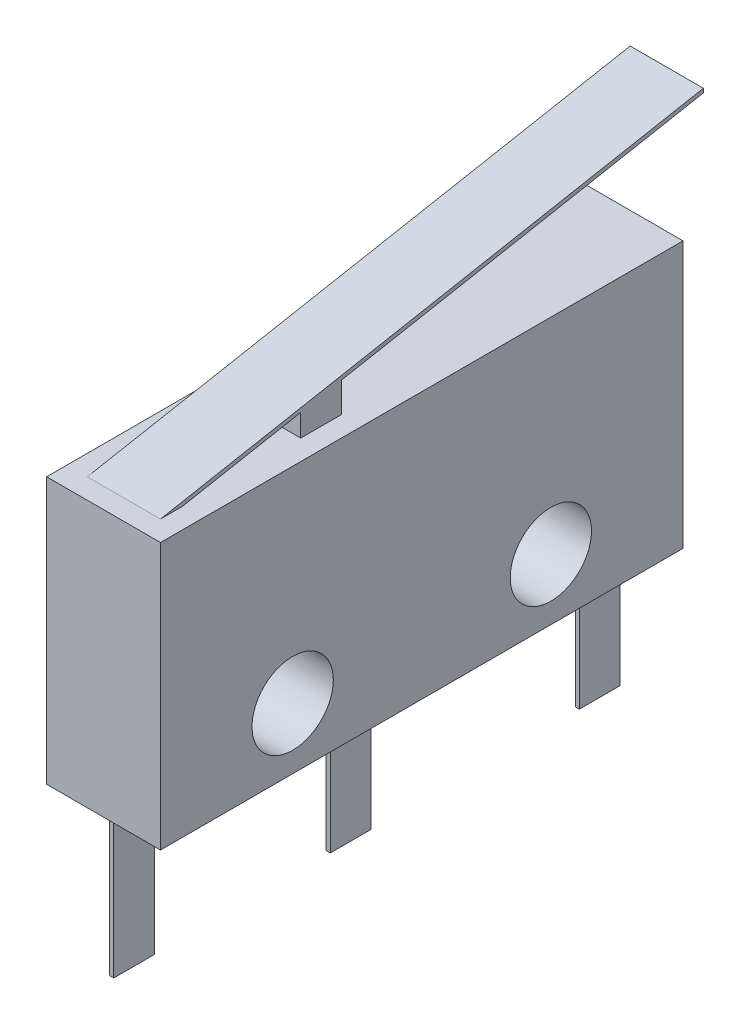
ISO-10303-21;
HEADER;
FILE_DESCRIPTION(('STEP AP214'),'2;1');
FILE_NAME('part.step','',(''),(''),'','','');
FILE_SCHEMA(('AUTOMOTIVE_DESIGN { 1 0 10303 214 1 1 1 1 }'));
ENDSEC;
DATA;
#1=APPLICATION_CONTEXT('core data for automotive mechanical design processes');
#2=APPLICATION_PROTOCOL_DEFINITION('international standard','automotive_design',2000,#1);
#3=PRODUCT_CONTEXT('',#1,'mechanical');
#4=PRODUCT('Part','Part','',(#3));
#5=PRODUCT_RELATED_PRODUCT_CATEGORY('part','',(#4));
#6=PRODUCT_DEFINITION_FORMATION('','',#4);
#7=PRODUCT_DEFINITION_CONTEXT('part definition',#1,'design');
#8=PRODUCT_DEFINITION('design','',#6,#7);
#9=PRODUCT_DEFINITION_SHAPE('','',#8);
#10=(LENGTH_UNIT() NAMED_UNIT(*) SI_UNIT(.MILLI.,.METRE.));
#11=(NAMED_UNIT(*) PLANE_ANGLE_UNIT() SI_UNIT($,.RADIAN.));
#12=(NAMED_UNIT(*) SI_UNIT($,.STERADIAN.) SOLID_ANGLE_UNIT());
#13=UNCERTAINTY_MEASURE_WITH_UNIT(LENGTH_MEASURE(1.E-05),#10,'distance_accuracy_value','');
#14=(GEOMETRIC_REPRESENTATION_CONTEXT(3) GLOBAL_UNCERTAINTY_ASSIGNED_CONTEXT((#13)) GLOBAL_UNIT_ASSIGNED_CONTEXT((#10,
#11,#12)) REPRESENTATION_CONTEXT('',''));
#15=CARTESIAN_POINT('',(0.,0.,0.));
#16=DIRECTION('',(0.,0.,1.));
#17=DIRECTION('',(1.,0.,0.));
#18=AXIS2_PLACEMENT_3D('',#15,#16,#17);
#19=CARTESIAN_POINT('',(2.8,0.,0.));
#20=DIRECTION('',(0.,1.,0.));
#21=DIRECTION('',(0.,0.,1.));
#22=AXIS2_PLACEMENT_3D('',#19,#20,#21);
#23=PLANE('',#22);
#24=DIRECTION('',(0.,0.,-1.));
#25=VECTOR('',#24,1.);
#26=CARTESIAN_POINT('',(1.35,0.,-5.525));
#27=LINE('',#26,#25);
#28=CARTESIAN_POINT('',(1.35,0.,-5.525));
#29=VERTEX_POINT('',#28);
#30=CARTESIAN_POINT('',(1.35,0.,-6.525));
#31=VERTEX_POINT('',#30);
#32=EDGE_CURVE('E256',#29,#31,#27,.T.);
#33=ORIENTED_EDGE('',*,*,#32,.F.);
#34=DIRECTION('',(-1.,0.,0.));
#35=VECTOR('',#34,1.);
#36=CARTESIAN_POINT('',(1.35,0.,-5.525));
#37=LINE('',#36,#35);
#38=CARTESIAN_POINT('',(1.45,0.,-5.525));
#39=VERTEX_POINT('',#38);
#40=EDGE_CURVE('E246',#39,#29,#37,.T.);
#41=ORIENTED_EDGE('',*,*,#40,.F.);
#42=DIRECTION('',(0.,0.,1.));
#43=VECTOR('',#42,1.);
#44=CARTESIAN_POINT('',(1.45,0.,-5.525));
#45=LINE('',#44,#43);
#46=CARTESIAN_POINT('',(1.45,0.,-6.525));
#47=VERTEX_POINT('',#46);
#48=EDGE_CURVE('E249',#47,#39,#45,.T.);
#49=ORIENTED_EDGE('',*,*,#48,.F.);
#50=DIRECTION('',(1.,0.,0.));
#51=VECTOR('',#50,1.);
#52=CARTESIAN_POINT('',(1.35,0.,-6.525));
#53=LINE('',#52,#51);
#54=EDGE_CURVE('E253',#31,#47,#53,.T.);
#55=ORIENTED_EDGE('',*,*,#54,.F.);
#56=EDGE_LOOP('',(#33,#41,#49,#55));
#57=FACE_BOUND('',#56,.T.);
#58=DIRECTION('',(0.,0.,-1.));
#59=VECTOR('',#58,1.);
#60=CARTESIAN_POINT('',(0.,0.,0.));
#61=LINE('',#60,#59);
#62=CARTESIAN_POINT('',(0.,0.,0.));
#63=VERTEX_POINT('',#62);
#64=CARTESIAN_POINT('',(0.,0.,-12.85));
#65=VERTEX_POINT('',#64);
#66=EDGE_CURVE('E383',#63,#65,#61,.T.);
#67=ORIENTED_EDGE('',*,*,#66,.T.);
#68=DIRECTION('',(-1.,0.,0.));
#69=VECTOR('',#68,1.);
#70=CARTESIAN_POINT('',(2.8,0.,-12.85));
#71=LINE('',#70,#69);
#72=CARTESIAN_POINT('',(2.8,0.,-12.85));
#73=VERTEX_POINT('',#72);
#74=EDGE_CURVE('E392',#73,#65,#71,.T.);
#75=ORIENTED_EDGE('',*,*,#74,.F.);
#76=DIRECTION('',(0.,0.,-1.));
#77=VECTOR('',#76,1.);
#78=CARTESIAN_POINT('',(2.8,0.,0.));
#79=LINE('',#78,#77);
#80=CARTESIAN_POINT('',(2.8,0.,0.));
#81=VERTEX_POINT('',#80);
#82=EDGE_CURVE('E373',#81,#73,#79,.T.);
#83=ORIENTED_EDGE('',*,*,#82,.F.);
#84=DIRECTION('',(-1.,0.,0.));
#85=VECTOR('',#84,1.);
#86=CARTESIAN_POINT('',(2.8,0.,0.));
#87=LINE('',#86,#85);
#88=EDGE_CURVE('E45',#81,#63,#87,.T.);
#89=ORIENTED_EDGE('',*,*,#88,.T.);
#90=EDGE_LOOP('',(#67,#75,#83,#89));
#91=FACE_BOUND('',#90,.T.);
#92=DIRECTION('',(0.,0.,-1.));
#93=VECTOR('',#92,1.);
#94=CARTESIAN_POINT('',(1.35,0.,-0.2));
#95=LINE('',#94,#93);
#96=CARTESIAN_POINT('',(1.35,0.,-0.2));
#97=VERTEX_POINT('',#96);
#98=CARTESIAN_POINT('',(1.35,0.,-1.2));
#99=VERTEX_POINT('',#98);
#100=EDGE_CURVE('E259',#97,#99,#95,.T.);
#101=ORIENTED_EDGE('',*,*,#100,.F.);
#102=DIRECTION('',(-1.,0.,0.));
#103=VECTOR('',#102,1.);
#104=CARTESIAN_POINT('',(1.35,0.,-0.2));
#105=LINE('',#104,#103);
#106=CARTESIAN_POINT('',(1.45,0.,-0.2));
#107=VERTEX_POINT('',#106);
#108=EDGE_CURVE('E271',#107,#97,#105,.T.);
#109=ORIENTED_EDGE('',*,*,#108,.F.);
#110=DIRECTION('',(0.,0.,1.));
#111=VECTOR('',#110,1.);
#112=CARTESIAN_POINT('',(1.45,0.,-0.2));
#113=LINE('',#112,#111);
#114=CARTESIAN_POINT('',(1.45,0.,-1.2));
#115=VERTEX_POINT('',#114);
#116=EDGE_CURVE('E283',#115,#107,#113,.T.);
#117=ORIENTED_EDGE('',*,*,#116,.F.);
#118=DIRECTION('',(1.,0.,0.));
#119=VECTOR('',#118,1.);
#120=CARTESIAN_POINT('',(1.35,0.,-1.2));
#121=LINE('',#120,#119);
#122=EDGE_CURVE('E280',#99,#115,#121,.T.);
#123=ORIENTED_EDGE('',*,*,#122,.F.);
#124=EDGE_LOOP('',(#101,#109,#117,#123));
#125=FACE_BOUND('',#124,.T.);
#126=DIRECTION('',(0.,0.,-1.));
#127=VECTOR('',#126,1.);
#128=CARTESIAN_POINT('',(1.35,0.,-11.65));
#129=LINE('',#128,#127);
#130=CARTESIAN_POINT('',(1.35,0.,-11.65));
#131=VERTEX_POINT('',#130);
#132=CARTESIAN_POINT('',(1.35,0.,-12.65));
#133=VERTEX_POINT('',#132);
#134=EDGE_CURVE('E199',#131,#133,#129,.T.);
#135=ORIENTED_EDGE('',*,*,#134,.F.);
#136=DIRECTION('',(-1.,0.,0.));
#137=VECTOR('',#136,1.);
#138=CARTESIAN_POINT('',(1.35,0.,-11.65));
#139=LINE('',#138,#137);
#140=CARTESIAN_POINT('',(1.45,0.,-11.65));
#141=VERTEX_POINT('',#140);
#142=EDGE_CURVE('E201',#141,#131,#139,.T.);
#143=ORIENTED_EDGE('',*,*,#142,.F.);
#144=DIRECTION('',(0.,0.,1.));
#145=VECTOR('',#144,1.);
#146=CARTESIAN_POINT('',(1.45,0.,-11.65));
#147=LINE('',#146,#145);
#148=CARTESIAN_POINT('',(1.45,0.,-12.65));
#149=VERTEX_POINT('',#148);
#150=EDGE_CURVE('E62',#149,#141,#147,.T.);
#151=ORIENTED_EDGE('',*,*,#150,.F.);
#152=DIRECTION('',(1.,0.,0.));
#153=VECTOR('',#152,1.);
#154=CARTESIAN_POINT('',(1.35,0.,-12.65));
#155=LINE('',#154,#153);
#156=EDGE_CURVE('E57',#133,#149,#155,.T.);
#157=ORIENTED_EDGE('',*,*,#156,.F.);
#158=EDGE_LOOP('',(#135,#143,#151,#157));
#159=FACE_BOUND('',#158,.T.);
#160=ADVANCED_FACE('F41',(#57,#91,#125,#159),#23,.F.);
#161=CARTESIAN_POINT('',(2.8,6.55,0.));
#162=DIRECTION('',(0.,-1.,0.));
#163=DIRECTION('',(0.,0.,-1.));
#164=AXIS2_PLACEMENT_3D('',#161,#162,#163);
#165=PLANE('',#164);
#166=DIRECTION('',(0.,0.,1.));
#167=VECTOR('',#166,1.);
#168=CARTESIAN_POINT('',(0.5,6.55,-0.5));
#169=LINE('',#168,#167);
#170=CARTESIAN_POINT('',(0.5,6.55,-1.03399999999999));
#171=VERTEX_POINT('',#170);
#172=CARTESIAN_POINT('',(0.5,6.55,-0.5));
#173=VERTEX_POINT('',#172);
#174=EDGE_CURVE('E11',#171,#173,#169,.T.);
#175=ORIENTED_EDGE('',*,*,#174,.F.);
#176=DIRECTION('',(1.,0.,0.));
#177=VECTOR('',#176,1.);
#178=CARTESIAN_POINT('',(0.,6.55,-1.03399999999999));
#179=LINE('',#178,#177);
#180=CARTESIAN_POINT('',(2.3,6.55,-1.03399999999999));
#181=VERTEX_POINT('',#180);
#182=EDGE_CURVE('E328',#171,#181,#179,.T.);
#183=ORIENTED_EDGE('',*,*,#182,.T.);
#184=DIRECTION('',(0.,0.,-1.));
#185=VECTOR('',#184,1.);
#186=CARTESIAN_POINT('',(2.3,6.55,-0.5));
#187=LINE('',#186,#185);
#188=CARTESIAN_POINT('',(2.3,6.55,-0.5));
#189=VERTEX_POINT('',#188);
#190=EDGE_CURVE('E347',#189,#181,#187,.T.);
#191=ORIENTED_EDGE('',*,*,#190,.F.);
#192=DIRECTION('',(1.,0.,0.));
#193=VECTOR('',#192,1.);
#194=CARTESIAN_POINT('',(0.5,6.55,-0.5));
#195=LINE('',#194,#193);
#196=EDGE_CURVE('E344',#173,#189,#195,.T.);
#197=ORIENTED_EDGE('',*,*,#196,.F.);
#198=EDGE_LOOP('',(#175,#183,#191,#197));
#199=FACE_BOUND('',#198,.T.);
#200=DIRECTION('',(0.,0.,1.));
#201=VECTOR('',#200,1.);
#202=CARTESIAN_POINT('',(0.,6.55,0.));
#203=LINE('',#202,#201);
#204=CARTESIAN_POINT('',(0.,6.55,-12.85));
#205=VERTEX_POINT('',#204);
#206=CARTESIAN_POINT('',(0.,6.55,0.));
#207=VERTEX_POINT('',#206);
#208=EDGE_CURVE('E374',#205,#207,#203,.T.);
#209=ORIENTED_EDGE('',*,*,#208,.T.);
#210=DIRECTION('',(-1.,0.,0.));
#211=VECTOR('',#210,1.);
#212=CARTESIAN_POINT('',(2.8,6.55,0.));
#213=LINE('',#212,#211);
#214=CARTESIAN_POINT('',(2.8,6.55,0.));
#215=VERTEX_POINT('',#214);
#216=EDGE_CURVE('E380',#215,#207,#213,.T.);
#217=ORIENTED_EDGE('',*,*,#216,.F.);
#218=DIRECTION('',(0.,0.,1.));
#219=VECTOR('',#218,1.);
#220=CARTESIAN_POINT('',(2.8,6.55,0.));
#221=LINE('',#220,#219);
#222=CARTESIAN_POINT('',(2.8,6.55,-12.85));
#223=VERTEX_POINT('',#222);
#224=EDGE_CURVE('E378',#223,#215,#221,.T.);
#225=ORIENTED_EDGE('',*,*,#224,.F.);
#226=DIRECTION('',(-1.,0.,0.));
#227=VECTOR('',#226,1.);
#228=CARTESIAN_POINT('',(2.8,6.55,-12.85));
#229=LINE('',#228,#227);
#230=EDGE_CURVE('E391',#223,#205,#229,.T.);
#231=ORIENTED_EDGE('',*,*,#230,.T.);
#232=EDGE_LOOP('',(#209,#217,#225,#231));
#233=FACE_BOUND('',#232,.T.);
#234=DIRECTION('',(-1.,0.,0.));
#235=VECTOR('',#234,1.);
#236=CARTESIAN_POINT('',(0.5,6.55,-4.94894801943664));
#237=LINE('',#236,#235);
#238=CARTESIAN_POINT('',(2.3,6.55,-4.94894801943664));
#239=VERTEX_POINT('',#238);
#240=CARTESIAN_POINT('',(0.5,6.55,-4.94894801943664));
#241=VERTEX_POINT('',#240);
#242=EDGE_CURVE('E304',#239,#241,#237,.T.);
#243=ORIENTED_EDGE('',*,*,#242,.F.);
#244=DIRECTION('',(0.,0.,-1.));
#245=VECTOR('',#244,1.);
#246=CARTESIAN_POINT('',(2.3,6.55,-4.94894801943664));
#247=LINE('',#246,#245);
#248=CARTESIAN_POINT('',(2.3,6.55,-3.94894801943664));
#249=VERTEX_POINT('',#248);
#250=EDGE_CURVE('E300',#249,#239,#247,.T.);
#251=ORIENTED_EDGE('',*,*,#250,.F.);
#252=DIRECTION('',(1.,0.,0.));
#253=VECTOR('',#252,1.);
#254=CARTESIAN_POINT('',(0.5,6.55,-3.94894801943664));
#255=LINE('',#254,#253);
#256=CARTESIAN_POINT('',(0.5,6.55,-3.94894801943664));
#257=VERTEX_POINT('',#256);
#258=EDGE_CURVE('E303',#257,#249,#255,.T.);
#259=ORIENTED_EDGE('',*,*,#258,.F.);
#260=DIRECTION('',(0.,0.,1.));
#261=VECTOR('',#260,1.);
#262=CARTESIAN_POINT('',(0.5,6.55,-4.94894801943664));
#263=LINE('',#262,#261);
#264=EDGE_CURVE('E308',#241,#257,#263,.T.);
#265=ORIENTED_EDGE('',*,*,#264,.F.);
#266=EDGE_LOOP('',(#243,#251,#259,#265));
#267=FACE_BOUND('',#266,.T.);
#268=ADVANCED_FACE('F414',(#199,#233,#267),#165,.F.);
#269=CARTESIAN_POINT('',(0.,6.55,-1.03399999999999));
#270=DIRECTION('',(0.,0.982913837182172,0.184066261644601));
#271=DIRECTION('',(0.,-0.184066261644601,0.982913837182172));
#272=AXIS2_PLACEMENT_3D('',#269,#270,#271);
#273=PLANE('',#272);
#274=DIRECTION('',(-1.,0.,0.));
#275=VECTOR('',#274,1.);
#276=CARTESIAN_POINT('',(0.5,7.28313633322784,-4.94894801943664));
#277=LINE('',#276,#275);
#278=CARTESIAN_POINT('',(2.3,7.28313633322783,-4.94894801943664));
#279=VERTEX_POINT('',#278);
#280=CARTESIAN_POINT('',(0.5,7.28313633322783,-4.94894801943664));
#281=VERTEX_POINT('',#280);
#282=EDGE_CURVE('E299',#279,#281,#277,.T.);
#283=ORIENTED_EDGE('',*,*,#282,.T.);
#284=DIRECTION('',(0.,-0.184066261644601,0.982913837182172));
#285=VECTOR('',#284,1.);
#286=CARTESIAN_POINT('',(0.5,6.53808901055713,-0.970395316375069));
#287=LINE('',#286,#285);
#288=CARTESIAN_POINT('',(0.5,8.95,-13.85));
#289=VERTEX_POINT('',#288);
#290=EDGE_CURVE('E341',#289,#281,#287,.T.);
#291=ORIENTED_EDGE('',*,*,#290,.F.);
#292=DIRECTION('',(1.,0.,0.));
#293=VECTOR('',#292,1.);
#294=CARTESIAN_POINT('',(0.,8.95,-13.85));
#295=LINE('',#294,#293);
#296=CARTESIAN_POINT('',(2.3,8.95,-13.85));
#297=VERTEX_POINT('',#296);
#298=EDGE_CURVE('E311',#289,#297,#295,.T.);
#299=ORIENTED_EDGE('',*,*,#298,.T.);
#300=DIRECTION('',(0.,-0.184066261644601,0.982913837182172));
#301=VECTOR('',#300,1.);
#302=CARTESIAN_POINT('',(2.3,6.55,-1.03399999999999));
#303=LINE('',#302,#301);
#304=EDGE_CURVE('E333',#297,#279,#303,.T.);
#305=ORIENTED_EDGE('',*,*,#304,.T.);
#306=EDGE_LOOP('',(#283,#291,#299,#305));
#307=FACE_BOUND('',#306,.T.);
#308=ADVANCED_FACE('F448',(#307),#273,.F.);
#309=DIRECTION('',(1.,0.,0.));
#310=VECTOR('',#309,1.);
#311=CARTESIAN_POINT('',(0.5,7.09587041562484,-3.94894801943664));
#312=LINE('',#311,#310);
#313=CARTESIAN_POINT('',(0.5,7.09587041562484,-3.94894801943664));
#314=VERTEX_POINT('',#313);
#315=CARTESIAN_POINT('',(2.3,7.09587041562484,-3.94894801943664));
#316=VERTEX_POINT('',#315);
#317=EDGE_CURVE('E318',#314,#316,#312,.T.);
#318=ORIENTED_EDGE('',*,*,#317,.T.);
#319=EDGE_CURVE('E331',#316,#181,#303,.T.);
#320=ORIENTED_EDGE('',*,*,#319,.T.);
#321=ORIENTED_EDGE('',*,*,#182,.F.);
#322=EDGE_CURVE('E340',#314,#171,#287,.T.);
#323=ORIENTED_EDGE('',*,*,#322,.F.);
#324=EDGE_LOOP('',(#318,#320,#321,#323));
#325=FACE_BOUND('',#324,.T.);
#326=ADVANCED_FACE('F420',(#325),#273,.F.);
#327=CARTESIAN_POINT('',(2.8,0.,0.));
#328=DIRECTION('',(-1.,0.,0.));
#329=DIRECTION('',(0.,0.,1.));
#330=AXIS2_PLACEMENT_3D('',#327,#328,#329);
#331=PLANE('',#330);
#332=DIRECTION('',(0.,-1.,0.));
#333=VECTOR('',#332,1.);
#334=CARTESIAN_POINT('',(2.8,0.,0.));
#335=LINE('',#334,#333);
#336=EDGE_CURVE('E370',#215,#81,#335,.T.);
#337=ORIENTED_EDGE('',*,*,#336,.T.);
#338=ORIENTED_EDGE('',*,*,#82,.T.);
#339=DIRECTION('',(0.,1.,0.));
#340=VECTOR('',#339,1.);
#341=CARTESIAN_POINT('',(2.8,0.,-12.85));
#342=LINE('',#341,#340);
#343=EDGE_CURVE('E376',#73,#223,#342,.T.);
#344=ORIENTED_EDGE('',*,*,#343,.T.);
#345=ORIENTED_EDGE('',*,*,#224,.T.);
#346=EDGE_LOOP('',(#337,#338,#344,#345));
#347=FACE_BOUND('',#346,.T.);
#348=CARTESIAN_POINT('',(2.8,1.5,-3.25));
#349=DIRECTION('',(1.,0.,0.));
#350=DIRECTION('',(0.,0.,-1.));
#351=AXIS2_PLACEMENT_3D('',#348,#349,#350);
#352=CIRCLE('',#351,1.);
#353=CARTESIAN_POINT('',(2.8,1.5,-4.25));
#354=VERTEX_POINT('',#353);
#355=EDGE_CURVE('E364',#354,#354,#352,.T.);
#356=ORIENTED_EDGE('',*,*,#355,.F.);
#357=EDGE_LOOP('',(#356));
#358=FACE_BOUND('',#357,.T.);
#359=CARTESIAN_POINT('',(2.8,1.5,-9.6));
#360=DIRECTION('',(1.,0.,0.));
#361=DIRECTION('',(0.,0.,-1.));
#362=AXIS2_PLACEMENT_3D('',#359,#360,#361);
#363=CIRCLE('',#362,1.);
#364=CARTESIAN_POINT('',(2.8,1.5,-10.6));
#365=VERTEX_POINT('',#364);
#366=EDGE_CURVE('E358',#365,#365,#363,.T.);
#367=ORIENTED_EDGE('',*,*,#366,.F.);
#368=EDGE_LOOP('',(#367));
#369=FACE_BOUND('',#368,.T.);
#370=ADVANCED_FACE('F417',(#347,#358,#369),#331,.F.);
#371=CARTESIAN_POINT('',(0.,0.,0.));
#372=DIRECTION('',(-1.,0.,0.));
#373=DIRECTION('',(0.,0.,1.));
#374=AXIS2_PLACEMENT_3D('',#371,#372,#373);
#375=PLANE('',#374);
#376=CARTESIAN_POINT('',(0.,1.5,-3.25));
#377=DIRECTION('',(1.,0.,0.));
#378=DIRECTION('',(0.,0.,-1.));
#379=AXIS2_PLACEMENT_3D('',#376,#377,#378);
#380=CIRCLE('',#379,1.);
#381=CARTESIAN_POINT('',(0.,1.5,-4.25));
#382=VERTEX_POINT('',#381);
#383=EDGE_CURVE('E361',#382,#382,#380,.T.);
#384=ORIENTED_EDGE('',*,*,#383,.T.);
#385=EDGE_LOOP('',(#384));
#386=FACE_BOUND('',#385,.T.);
#387=DIRECTION('',(0.,-1.,0.));
#388=VECTOR('',#387,1.);
#389=CARTESIAN_POINT('',(0.,0.,0.));
#390=LINE('',#389,#388);
#391=EDGE_CURVE('E367',#207,#63,#390,.T.);
#392=ORIENTED_EDGE('',*,*,#391,.F.);
#393=ORIENTED_EDGE('',*,*,#208,.F.);
#394=DIRECTION('',(0.,1.,0.));
#395=VECTOR('',#394,1.);
#396=CARTESIAN_POINT('',(0.,0.,-12.85));
#397=LINE('',#396,#395);
#398=EDGE_CURVE('E385',#65,#205,#397,.T.);
#399=ORIENTED_EDGE('',*,*,#398,.F.);
#400=ORIENTED_EDGE('',*,*,#66,.F.);
#401=EDGE_LOOP('',(#392,#393,#399,#400));
#402=FACE_BOUND('',#401,.T.);
#403=CARTESIAN_POINT('',(0.,1.5,-9.6));
#404=DIRECTION('',(1.,0.,0.));
#405=DIRECTION('',(0.,0.,-1.));
#406=AXIS2_PLACEMENT_3D('',#403,#404,#405);
#407=CIRCLE('',#406,1.);
#408=CARTESIAN_POINT('',(0.,1.5,-10.6));
#409=VERTEX_POINT('',#408);
#410=EDGE_CURVE('E357',#409,#409,#407,.T.);
#411=ORIENTED_EDGE('',*,*,#410,.T.);
#412=EDGE_LOOP('',(#411));
#413=FACE_BOUND('',#412,.T.);
#414=ADVANCED_FACE('F408',(#386,#402,#413),#375,.T.);
#415=CARTESIAN_POINT('',(2.8,0.,0.));
#416=DIRECTION('',(0.,0.,-1.));
#417=DIRECTION('',(-1.,0.,0.));
#418=AXIS2_PLACEMENT_3D('',#415,#416,#417);
#419=PLANE('',#418);
#420=ORIENTED_EDGE('',*,*,#391,.T.);
#421=ORIENTED_EDGE('',*,*,#88,.F.);
#422=ORIENTED_EDGE('',*,*,#336,.F.);
#423=ORIENTED_EDGE('',*,*,#216,.T.);
#424=EDGE_LOOP('',(#420,#421,#422,#423));
#425=FACE_BOUND('',#424,.T.);
#426=ADVANCED_FACE('F43',(#425),#419,.F.);
#427=CARTESIAN_POINT('',(2.8,0.,-12.85));
#428=DIRECTION('',(0.,0.,1.));
#429=DIRECTION('',(1.,0.,0.));
#430=AXIS2_PLACEMENT_3D('',#427,#428,#429);
#431=PLANE('',#430);
#432=ORIENTED_EDGE('',*,*,#398,.T.);
#433=ORIENTED_EDGE('',*,*,#230,.F.);
#434=ORIENTED_EDGE('',*,*,#343,.F.);
#435=ORIENTED_EDGE('',*,*,#74,.T.);
#436=EDGE_LOOP('',(#432,#433,#434,#435));
#437=FACE_BOUND('',#436,.T.);
#438=ADVANCED_FACE('F411',(#437),#431,.F.);
#439=CARTESIAN_POINT('',(2.8,1.5,-3.25));
#440=DIRECTION('',(-1.,0.,0.));
#441=DIRECTION('',(0.,0.,1.));
#442=AXIS2_PLACEMENT_3D('',#439,#440,#441);
#443=CYLINDRICAL_SURFACE('',#442,1.);
#444=ORIENTED_EDGE('',*,*,#355,.T.);
#445=EDGE_LOOP('',(#444));
#446=FACE_BOUND('',#445,.T.);
#447=ORIENTED_EDGE('',*,*,#383,.F.);
#448=EDGE_LOOP('',(#447));
#449=FACE_BOUND('',#448,.T.);
#450=ADVANCED_FACE('F430',(#446,#449),#443,.F.);
#451=CARTESIAN_POINT('',(2.8,1.5,-9.6));
#452=DIRECTION('',(-1.,0.,0.));
#453=DIRECTION('',(0.,0.,1.));
#454=AXIS2_PLACEMENT_3D('',#451,#452,#453);
#455=CYLINDRICAL_SURFACE('',#454,1.);
#456=ORIENTED_EDGE('',*,*,#366,.T.);
#457=EDGE_LOOP('',(#456));
#458=FACE_BOUND('',#457,.T.);
#459=ORIENTED_EDGE('',*,*,#410,.F.);
#460=EDGE_LOOP('',(#459));
#461=FACE_BOUND('',#460,.T.);
#462=ADVANCED_FACE('F426',(#458,#461),#455,.F.);
#463=CARTESIAN_POINT('',(0.5,9.05,-0.5));
#464=DIRECTION('',(1.,0.,0.));
#465=DIRECTION('',(0.,0.,-1.));
#466=AXIS2_PLACEMENT_3D('',#463,#464,#465);
#467=PLANE('',#466);
#468=DIRECTION('',(0.,-1.,0.));
#469=VECTOR('',#468,1.);
#470=CARTESIAN_POINT('',(0.5,9.05,-13.85));
#471=LINE('',#470,#469);
#472=CARTESIAN_POINT('',(0.5,9.05,-13.85));
#473=VERTEX_POINT('',#472);
#474=EDGE_CURVE('E346',#473,#289,#471,.T.);
#475=ORIENTED_EDGE('',*,*,#474,.T.);
#476=ORIENTED_EDGE('',*,*,#290,.T.);
#477=DIRECTION('',(0.,-1.,0.));
#478=VECTOR('',#477,1.);
#479=CARTESIAN_POINT('',(0.5,9.052,-4.94894801943664));
#480=LINE('',#479,#478);
#481=EDGE_CURVE('E307',#281,#241,#480,.T.);
#482=ORIENTED_EDGE('',*,*,#481,.T.);
#483=ORIENTED_EDGE('',*,*,#264,.T.);
#484=DIRECTION('',(0.,-1.,0.));
#485=VECTOR('',#484,1.);
#486=CARTESIAN_POINT('',(0.5,9.052,-3.94894801943664));
#487=LINE('',#486,#485);
#488=EDGE_CURVE('E314',#314,#257,#487,.T.);
#489=ORIENTED_EDGE('',*,*,#488,.F.);
#490=ORIENTED_EDGE('',*,*,#322,.T.);
#491=ORIENTED_EDGE('',*,*,#174,.T.);
#492=DIRECTION('',(0.,0.184066261644601,-0.982913837182172));
#493=VECTOR('',#492,1.);
#494=CARTESIAN_POINT('',(0.5,6.63470097168955,-0.952303188822182));
#495=LINE('',#494,#493);
#496=EDGE_CURVE('E337',#173,#473,#495,.T.);
#497=ORIENTED_EDGE('',*,*,#496,.T.);
#498=EDGE_LOOP('',(#475,#476,#482,#483,#489,#490,#491,#497));
#499=FACE_BOUND('',#498,.T.);
#500=ADVANCED_FACE('F429',(#499),#467,.F.);
#501=CARTESIAN_POINT('',(2.3,9.05,-0.5));
#502=DIRECTION('',(-1.,0.,0.));
#503=DIRECTION('',(0.,0.,1.));
#504=AXIS2_PLACEMENT_3D('',#501,#502,#503);
#505=PLANE('',#504);
#506=ORIENTED_EDGE('',*,*,#190,.T.);
#507=ORIENTED_EDGE('',*,*,#319,.F.);
#508=DIRECTION('',(0.,-1.,0.));
#509=VECTOR('',#508,1.);
#510=CARTESIAN_POINT('',(2.3,9.052,-3.94894801943664));
#511=LINE('',#510,#509);
#512=EDGE_CURVE('E317',#316,#249,#511,.T.);
#513=ORIENTED_EDGE('',*,*,#512,.T.);
#514=ORIENTED_EDGE('',*,*,#250,.T.);
#515=DIRECTION('',(0.,-1.,0.));
#516=VECTOR('',#515,1.);
#517=CARTESIAN_POINT('',(2.3,9.052,-4.94894801943664));
#518=LINE('',#517,#516);
#519=EDGE_CURVE('E321',#279,#239,#518,.T.);
#520=ORIENTED_EDGE('',*,*,#519,.F.);
#521=ORIENTED_EDGE('',*,*,#304,.F.);
#522=DIRECTION('',(0.,-1.,0.));
#523=VECTOR('',#522,1.);
#524=CARTESIAN_POINT('',(2.3,9.05,-13.85));
#525=LINE('',#524,#523);
#526=CARTESIAN_POINT('',(2.3,9.05,-13.85));
#527=VERTEX_POINT('',#526);
#528=EDGE_CURVE('E354',#527,#297,#525,.T.);
#529=ORIENTED_EDGE('',*,*,#528,.F.);
#530=DIRECTION('',(0.,0.184066261644601,-0.982913837182172));
#531=VECTOR('',#530,1.);
#532=CARTESIAN_POINT('',(2.3,6.55,-0.5));
#533=LINE('',#532,#531);
#534=EDGE_CURVE('E335',#189,#527,#533,.T.);
#535=ORIENTED_EDGE('',*,*,#534,.F.);
#536=EDGE_LOOP('',(#506,#507,#513,#514,#520,#521,#529,#535));
#537=FACE_BOUND('',#536,.T.);
#538=ADVANCED_FACE('F463',(#537),#505,.F.);
#539=CARTESIAN_POINT('',(0.5,9.05,-13.85));
#540=DIRECTION('',(0.,0.,1.));
#541=DIRECTION('',(1.,0.,0.));
#542=AXIS2_PLACEMENT_3D('',#539,#540,#541);
#543=PLANE('',#542);
#544=ORIENTED_EDGE('',*,*,#528,.T.);
#545=ORIENTED_EDGE('',*,*,#298,.F.);
#546=ORIENTED_EDGE('',*,*,#474,.F.);
#547=DIRECTION('',(-1.,0.,0.));
#548=VECTOR('',#547,1.);
#549=CARTESIAN_POINT('',(0.5,9.05,-13.85));
#550=LINE('',#549,#548);
#551=EDGE_CURVE('E345',#527,#473,#550,.T.);
#552=ORIENTED_EDGE('',*,*,#551,.F.);
#553=EDGE_LOOP('',(#544,#545,#546,#552));
#554=FACE_BOUND('',#553,.T.);
#555=ADVANCED_FACE('F467',(#554),#543,.F.);
#556=CARTESIAN_POINT('',(0.,6.55,-0.5));
#557=DIRECTION('',(0.,-0.982913837182172,-0.184066261644601));
#558=DIRECTION('',(0.,0.184066261644601,-0.982913837182172));
#559=AXIS2_PLACEMENT_3D('',#556,#557,#558);
#560=PLANE('',#559);
#561=ORIENTED_EDGE('',*,*,#196,.T.);
#562=ORIENTED_EDGE('',*,*,#534,.T.);
#563=ORIENTED_EDGE('',*,*,#551,.T.);
#564=ORIENTED_EDGE('',*,*,#496,.F.);
#565=EDGE_LOOP('',(#561,#562,#563,#564));
#566=FACE_BOUND('',#565,.T.);
#567=ADVANCED_FACE('F470',(#566),#560,.F.);
#568=CARTESIAN_POINT('',(0.5,9.052,-4.94894801943664));
#569=DIRECTION('',(0.,0.,1.));
#570=DIRECTION('',(1.,0.,0.));
#571=AXIS2_PLACEMENT_3D('',#568,#569,#570);
#572=PLANE('',#571);
#573=ORIENTED_EDGE('',*,*,#282,.F.);
#574=ORIENTED_EDGE('',*,*,#519,.T.);
#575=ORIENTED_EDGE('',*,*,#242,.T.);
#576=ORIENTED_EDGE('',*,*,#481,.F.);
#577=EDGE_LOOP('',(#573,#574,#575,#576));
#578=FACE_BOUND('',#577,.T.);
#579=ADVANCED_FACE('F474',(#578),#572,.F.);
#580=CARTESIAN_POINT('',(0.5,9.052,-3.94894801943664));
#581=DIRECTION('',(0.,0.,-1.));
#582=DIRECTION('',(-1.,0.,0.));
#583=AXIS2_PLACEMENT_3D('',#580,#581,#582);
#584=PLANE('',#583);
#585=ORIENTED_EDGE('',*,*,#317,.F.);
#586=ORIENTED_EDGE('',*,*,#488,.T.);
#587=ORIENTED_EDGE('',*,*,#258,.T.);
#588=ORIENTED_EDGE('',*,*,#512,.F.);
#589=EDGE_LOOP('',(#585,#586,#587,#588));
#590=FACE_BOUND('',#589,.T.);
#591=ADVANCED_FACE('F476',(#590),#584,.F.);
#592=CARTESIAN_POINT('',(1.35,-3.5,-0.2));
#593=DIRECTION('',(1.,0.,0.));
#594=DIRECTION('',(0.,0.,-1.));
#595=AXIS2_PLACEMENT_3D('',#592,#593,#594);
#596=PLANE('',#595);
#597=ORIENTED_EDGE('',*,*,#100,.T.);
#598=DIRECTION('',(0.,1.,0.));
#599=VECTOR('',#598,1.);
#600=CARTESIAN_POINT('',(1.35,-3.5,-1.2));
#601=LINE('',#600,#599);
#602=CARTESIAN_POINT('',(1.35,-3.5,-1.2));
#603=VERTEX_POINT('',#602);
#604=EDGE_CURVE('E296',#603,#99,#601,.T.);
#605=ORIENTED_EDGE('',*,*,#604,.F.);
#606=DIRECTION('',(0.,0.,-1.));
#607=VECTOR('',#606,1.);
#608=CARTESIAN_POINT('',(1.35,-3.5,-0.2));
#609=LINE('',#608,#607);
#610=CARTESIAN_POINT('',(1.35,-3.5,-0.2));
#611=VERTEX_POINT('',#610);
#612=EDGE_CURVE('E267',#611,#603,#609,.T.);
#613=ORIENTED_EDGE('',*,*,#612,.F.);
#614=DIRECTION('',(0.,1.,0.));
#615=VECTOR('',#614,1.);
#616=CARTESIAN_POINT('',(1.35,-3.5,-0.2));
#617=LINE('',#616,#615);
#618=EDGE_CURVE('E277',#611,#97,#617,.T.);
#619=ORIENTED_EDGE('',*,*,#618,.T.);
#620=EDGE_LOOP('',(#597,#605,#613,#619));
#621=FACE_BOUND('',#620,.T.);
#622=ADVANCED_FACE('F481',(#621),#596,.F.);
#623=CARTESIAN_POINT('',(1.35,-3.5,-1.2));
#624=DIRECTION('',(0.,0.,1.));
#625=DIRECTION('',(1.,0.,0.));
#626=AXIS2_PLACEMENT_3D('',#623,#624,#625);
#627=PLANE('',#626);
#628=ORIENTED_EDGE('',*,*,#122,.T.);
#629=DIRECTION('',(0.,1.,0.));
#630=VECTOR('',#629,1.);
#631=CARTESIAN_POINT('',(1.45,-3.5,-1.2));
#632=LINE('',#631,#630);
#633=CARTESIAN_POINT('',(1.45,-3.5,-1.2));
#634=VERTEX_POINT('',#633);
#635=EDGE_CURVE('E293',#634,#115,#632,.T.);
#636=ORIENTED_EDGE('',*,*,#635,.F.);
#637=DIRECTION('',(1.,0.,0.));
#638=VECTOR('',#637,1.);
#639=CARTESIAN_POINT('',(1.35,-3.5,-1.2));
#640=LINE('',#639,#638);
#641=EDGE_CURVE('E270',#603,#634,#640,.T.);
#642=ORIENTED_EDGE('',*,*,#641,.F.);
#643=ORIENTED_EDGE('',*,*,#604,.T.);
#644=EDGE_LOOP('',(#628,#636,#642,#643));
#645=FACE_BOUND('',#644,.T.);
#646=ADVANCED_FACE('F487',(#645),#627,.F.);
#647=CARTESIAN_POINT('',(1.45,-3.5,-0.2));
#648=DIRECTION('',(-1.,0.,0.));
#649=DIRECTION('',(0.,0.,1.));
#650=AXIS2_PLACEMENT_3D('',#647,#648,#649);
#651=PLANE('',#650);
#652=ORIENTED_EDGE('',*,*,#116,.T.);
#653=DIRECTION('',(0.,1.,0.));
#654=VECTOR('',#653,1.);
#655=CARTESIAN_POINT('',(1.45,-3.5,-0.2));
#656=LINE('',#655,#654);
#657=CARTESIAN_POINT('',(1.45,-3.5,-0.2));
#658=VERTEX_POINT('',#657);
#659=EDGE_CURVE('E290',#658,#107,#656,.T.);
#660=ORIENTED_EDGE('',*,*,#659,.F.);
#661=DIRECTION('',(0.,0.,1.));
#662=VECTOR('',#661,1.);
#663=CARTESIAN_POINT('',(1.45,-3.5,-0.2));
#664=LINE('',#663,#662);
#665=EDGE_CURVE('E273',#634,#658,#664,.T.);
#666=ORIENTED_EDGE('',*,*,#665,.F.);
#667=ORIENTED_EDGE('',*,*,#635,.T.);
#668=EDGE_LOOP('',(#652,#660,#666,#667));
#669=FACE_BOUND('',#668,.T.);
#670=ADVANCED_FACE('F491',(#669),#651,.F.);
#671=CARTESIAN_POINT('',(1.35,-3.5,-0.2));
#672=DIRECTION('',(0.,0.,-1.));
#673=DIRECTION('',(-1.,0.,0.));
#674=AXIS2_PLACEMENT_3D('',#671,#672,#673);
#675=PLANE('',#674);
#676=ORIENTED_EDGE('',*,*,#108,.T.);
#677=ORIENTED_EDGE('',*,*,#618,.F.);
#678=DIRECTION('',(-1.,0.,0.));
#679=VECTOR('',#678,1.);
#680=CARTESIAN_POINT('',(1.35,-3.5,-0.2));
#681=LINE('',#680,#679);
#682=EDGE_CURVE('E275',#658,#611,#681,.T.);
#683=ORIENTED_EDGE('',*,*,#682,.F.);
#684=ORIENTED_EDGE('',*,*,#659,.T.);
#685=EDGE_LOOP('',(#676,#677,#683,#684));
#686=FACE_BOUND('',#685,.T.);
#687=ADVANCED_FACE('F495',(#686),#675,.F.);
#688=CARTESIAN_POINT('',(0.,-3.5,0.));
#689=DIRECTION('',(0.,-1.,0.));
#690=DIRECTION('',(0.,0.,-1.));
#691=AXIS2_PLACEMENT_3D('',#688,#689,#690);
#692=PLANE('',#691);
#693=ORIENTED_EDGE('',*,*,#612,.T.);
#694=ORIENTED_EDGE('',*,*,#641,.T.);
#695=ORIENTED_EDGE('',*,*,#665,.T.);
#696=ORIENTED_EDGE('',*,*,#682,.T.);
#697=EDGE_LOOP('',(#693,#694,#695,#696));
#698=FACE_BOUND('',#697,.T.);
#699=ADVANCED_FACE('F499',(#698),#692,.T.);
#700=CARTESIAN_POINT('',(1.35,-3.5,-5.525));
#701=DIRECTION('',(1.,0.,0.));
#702=DIRECTION('',(0.,0.,-1.));
#703=AXIS2_PLACEMENT_3D('',#700,#701,#702);
#704=PLANE('',#703);
#705=ORIENTED_EDGE('',*,*,#32,.T.);
#706=DIRECTION('',(0.,1.,0.));
#707=VECTOR('',#706,1.);
#708=CARTESIAN_POINT('',(1.35,-3.5,-6.525));
#709=LINE('',#708,#707);
#710=CARTESIAN_POINT('',(1.35,-3.5,-6.525));
#711=VERTEX_POINT('',#710);
#712=EDGE_CURVE('E205',#711,#31,#709,.T.);
#713=ORIENTED_EDGE('',*,*,#712,.F.);
#714=DIRECTION('',(0.,0.,-1.));
#715=VECTOR('',#714,1.);
#716=CARTESIAN_POINT('',(1.35,-3.5,-5.525));
#717=LINE('',#716,#715);
#718=CARTESIAN_POINT('',(1.35,-3.5,-5.525));
#719=VERTEX_POINT('',#718);
#720=EDGE_CURVE('E250',#719,#711,#717,.T.);
#721=ORIENTED_EDGE('',*,*,#720,.F.);
#722=DIRECTION('',(0.,1.,0.));
#723=VECTOR('',#722,1.);
#724=CARTESIAN_POINT('',(1.35,-3.5,-5.525));
#725=LINE('',#724,#723);
#726=EDGE_CURVE('E242',#719,#29,#725,.T.);
#727=ORIENTED_EDGE('',*,*,#726,.T.);
#728=EDGE_LOOP('',(#705,#713,#721,#727));
#729=FACE_BOUND('',#728,.T.);
#730=ADVANCED_FACE('F503',(#729),#704,.F.);
#731=CARTESIAN_POINT('',(1.35,-3.5,-6.525));
#732=DIRECTION('',(0.,0.,1.));
#733=DIRECTION('',(1.,0.,0.));
#734=AXIS2_PLACEMENT_3D('',#731,#732,#733);
#735=PLANE('',#734);
#736=ORIENTED_EDGE('',*,*,#54,.T.);
#737=DIRECTION('',(0.,1.,0.));
#738=VECTOR('',#737,1.);
#739=CARTESIAN_POINT('',(1.45,-3.5,-6.525));
#740=LINE('',#739,#738);
#741=CARTESIAN_POINT('',(1.45,-3.5,-6.525));
#742=VERTEX_POINT('',#741);
#743=EDGE_CURVE('E236',#742,#47,#740,.T.);
#744=ORIENTED_EDGE('',*,*,#743,.F.);
#745=DIRECTION('',(1.,0.,0.));
#746=VECTOR('',#745,1.);
#747=CARTESIAN_POINT('',(1.35,-3.5,-6.525));
#748=LINE('',#747,#746);
#749=EDGE_CURVE('E263',#711,#742,#748,.T.);
#750=ORIENTED_EDGE('',*,*,#749,.F.);
#751=ORIENTED_EDGE('',*,*,#712,.T.);
#752=EDGE_LOOP('',(#736,#744,#750,#751));
#753=FACE_BOUND('',#752,.T.);
#754=ADVANCED_FACE('F516',(#753),#735,.F.);
#755=CARTESIAN_POINT('',(1.45,-3.5,-5.525));
#756=DIRECTION('',(-1.,0.,0.));
#757=DIRECTION('',(0.,0.,1.));
#758=AXIS2_PLACEMENT_3D('',#755,#756,#757);
#759=PLANE('',#758);
#760=ORIENTED_EDGE('',*,*,#48,.T.);
#761=DIRECTION('',(0.,1.,0.));
#762=VECTOR('',#761,1.);
#763=CARTESIAN_POINT('',(1.45,-3.5,-5.525));
#764=LINE('',#763,#762);
#765=CARTESIAN_POINT('',(1.45,-3.5,-5.525));
#766=VERTEX_POINT('',#765);
#767=EDGE_CURVE('E239',#766,#39,#764,.T.);
#768=ORIENTED_EDGE('',*,*,#767,.F.);
#769=DIRECTION('',(0.,0.,1.));
#770=VECTOR('',#769,1.);
#771=CARTESIAN_POINT('',(1.45,-3.5,-5.525));
#772=LINE('',#771,#770);
#773=EDGE_CURVE('E261',#742,#766,#772,.T.);
#774=ORIENTED_EDGE('',*,*,#773,.F.);
#775=ORIENTED_EDGE('',*,*,#743,.T.);
#776=EDGE_LOOP('',(#760,#768,#774,#775));
#777=FACE_BOUND('',#776,.T.);
#778=ADVANCED_FACE('F512',(#777),#759,.F.);
#779=CARTESIAN_POINT('',(1.35,-3.5,-5.525));
#780=DIRECTION('',(0.,0.,-1.));
#781=DIRECTION('',(-1.,0.,0.));
#782=AXIS2_PLACEMENT_3D('',#779,#780,#781);
#783=PLANE('',#782);
#784=ORIENTED_EDGE('',*,*,#40,.T.);
#785=ORIENTED_EDGE('',*,*,#726,.F.);
#786=DIRECTION('',(-1.,0.,0.));
#787=VECTOR('',#786,1.);
#788=CARTESIAN_POINT('',(1.35,-3.5,-5.525));
#789=LINE('',#788,#787);
#790=EDGE_CURVE('E245',#766,#719,#789,.T.);
#791=ORIENTED_EDGE('',*,*,#790,.F.);
#792=ORIENTED_EDGE('',*,*,#767,.T.);
#793=EDGE_LOOP('',(#784,#785,#791,#792));
#794=FACE_BOUND('',#793,.T.);
#795=ADVANCED_FACE('F508',(#794),#783,.F.);
#796=CARTESIAN_POINT('',(0.,-3.5,0.));
#797=DIRECTION('',(0.,-1.,0.));
#798=DIRECTION('',(0.,0.,-1.));
#799=AXIS2_PLACEMENT_3D('',#796,#797,#798);
#800=PLANE('',#799);
#801=ORIENTED_EDGE('',*,*,#720,.T.);
#802=ORIENTED_EDGE('',*,*,#749,.T.);
#803=ORIENTED_EDGE('',*,*,#773,.T.);
#804=ORIENTED_EDGE('',*,*,#790,.T.);
#805=EDGE_LOOP('',(#801,#802,#803,#804));
#806=FACE_BOUND('',#805,.T.);
#807=ADVANCED_FACE('F505',(#806),#800,.T.);
#808=CARTESIAN_POINT('',(1.35,-3.5,-11.65));
#809=DIRECTION('',(1.,0.,0.));
#810=DIRECTION('',(0.,0.,-1.));
#811=AXIS2_PLACEMENT_3D('',#808,#809,#810);
#812=PLANE('',#811);
#813=ORIENTED_EDGE('',*,*,#134,.T.);
#814=DIRECTION('',(0.,1.,0.));
#815=VECTOR('',#814,1.);
#816=CARTESIAN_POINT('',(1.35,-3.5,-12.65));
#817=LINE('',#816,#815);
#818=CARTESIAN_POINT('',(1.35,-3.5,-12.65));
#819=VERTEX_POINT('',#818);
#820=EDGE_CURVE('E748',#819,#133,#817,.T.);
#821=ORIENTED_EDGE('',*,*,#820,.F.);
#822=DIRECTION('',(0.,0.,-1.));
#823=VECTOR('',#822,1.);
#824=CARTESIAN_POINT('',(1.35,-3.5,-11.65));
#825=LINE('',#824,#823);
#826=CARTESIAN_POINT('',(1.35,-3.5,-11.65));
#827=VERTEX_POINT('',#826);
#828=EDGE_CURVE('E216',#827,#819,#825,.T.);
#829=ORIENTED_EDGE('',*,*,#828,.F.);
#830=DIRECTION('',(0.,1.,0.));
#831=VECTOR('',#830,1.);
#832=CARTESIAN_POINT('',(1.35,-3.5,-11.65));
#833=LINE('',#832,#831);
#834=EDGE_CURVE('E212',#827,#131,#833,.T.);
#835=ORIENTED_EDGE('',*,*,#834,.T.);
#836=EDGE_LOOP('',(#813,#821,#829,#835));
#837=FACE_BOUND('',#836,.T.);
#838=ADVANCED_FACE('F218',(#837),#812,.F.);
#839=CARTESIAN_POINT('',(1.35,-3.5,-12.65));
#840=DIRECTION('',(0.,0.,1.));
#841=DIRECTION('',(1.,0.,0.));
#842=AXIS2_PLACEMENT_3D('',#839,#840,#841);
#843=PLANE('',#842);
#844=ORIENTED_EDGE('',*,*,#156,.T.);
#845=DIRECTION('',(0.,1.,0.));
#846=VECTOR('',#845,1.);
#847=CARTESIAN_POINT('',(1.45,-3.5,-12.65));
#848=LINE('',#847,#846);
#849=CARTESIAN_POINT('',(1.45,-3.5,-12.65));
#850=VERTEX_POINT('',#849);
#851=EDGE_CURVE('E224',#850,#149,#848,.T.);
#852=ORIENTED_EDGE('',*,*,#851,.F.);
#853=DIRECTION('',(1.,0.,0.));
#854=VECTOR('',#853,1.);
#855=CARTESIAN_POINT('',(1.35,-3.5,-12.65));
#856=LINE('',#855,#854);
#857=EDGE_CURVE('E231',#819,#850,#856,.T.);
#858=ORIENTED_EDGE('',*,*,#857,.F.);
#859=ORIENTED_EDGE('',*,*,#820,.T.);
#860=EDGE_LOOP('',(#844,#852,#858,#859));
#861=FACE_BOUND('',#860,.T.);
#862=ADVANCED_FACE('F533',(#861),#843,.F.);
#863=CARTESIAN_POINT('',(1.45,-3.5,-11.65));
#864=DIRECTION('',(-1.,0.,0.));
#865=DIRECTION('',(0.,0.,1.));
#866=AXIS2_PLACEMENT_3D('',#863,#864,#865);
#867=PLANE('',#866);
#868=ORIENTED_EDGE('',*,*,#150,.T.);
#869=DIRECTION('',(0.,1.,0.));
#870=VECTOR('',#869,1.);
#871=CARTESIAN_POINT('',(1.45,-3.5,-11.65));
#872=LINE('',#871,#870);
#873=CARTESIAN_POINT('',(1.45,-3.5,-11.65));
#874=VERTEX_POINT('',#873);
#875=EDGE_CURVE('E215',#874,#141,#872,.T.);
#876=ORIENTED_EDGE('',*,*,#875,.F.);
#877=DIRECTION('',(0.,0.,1.));
#878=VECTOR('',#877,1.);
#879=CARTESIAN_POINT('',(1.45,-3.5,-11.65));
#880=LINE('',#879,#878);
#881=EDGE_CURVE('E222',#850,#874,#880,.T.);
#882=ORIENTED_EDGE('',*,*,#881,.F.);
#883=ORIENTED_EDGE('',*,*,#851,.T.);
#884=EDGE_LOOP('',(#868,#876,#882,#883));
#885=FACE_BOUND('',#884,.T.);
#886=ADVANCED_FACE('F530',(#885),#867,.F.);
#887=CARTESIAN_POINT('',(1.35,-3.5,-11.65));
#888=DIRECTION('',(0.,0.,-1.));
#889=DIRECTION('',(-1.,0.,0.));
#890=AXIS2_PLACEMENT_3D('',#887,#888,#889);
#891=PLANE('',#890);
#892=ORIENTED_EDGE('',*,*,#142,.T.);
#893=ORIENTED_EDGE('',*,*,#834,.F.);
#894=DIRECTION('',(-1.,0.,0.));
#895=VECTOR('',#894,1.);
#896=CARTESIAN_POINT('',(1.35,-3.5,-11.65));
#897=LINE('',#896,#895);
#898=EDGE_CURVE('E220',#874,#827,#897,.T.);
#899=ORIENTED_EDGE('',*,*,#898,.F.);
#900=ORIENTED_EDGE('',*,*,#875,.T.);
#901=EDGE_LOOP('',(#892,#893,#899,#900));
#902=FACE_BOUND('',#901,.T.);
#903=ADVANCED_FACE('F210',(#902),#891,.F.);
#904=CARTESIAN_POINT('',(0.,-3.5,0.));
#905=DIRECTION('',(0.,-1.,0.));
#906=DIRECTION('',(0.,0.,-1.));
#907=AXIS2_PLACEMENT_3D('',#904,#905,#906);
#908=PLANE('',#907);
#909=ORIENTED_EDGE('',*,*,#828,.T.);
#910=ORIENTED_EDGE('',*,*,#857,.T.);
#911=ORIENTED_EDGE('',*,*,#881,.T.);
#912=ORIENTED_EDGE('',*,*,#898,.T.);
#913=EDGE_LOOP('',(#909,#910,#911,#912));
#914=FACE_BOUND('',#913,.T.);
#915=ADVANCED_FACE('F524',(#914),#908,.T.);
#916=CLOSED_SHELL('',(#160,#268,#308,#326,#370,#414,#426,#438,#450,#462,#500,#538,#555,#567,
#579,#591,#622,#646,#670,#687,#699,#730,#754,#778,#795,#807,#838,#862,#886,#903,#915));
#917=MANIFOLD_SOLID_BREP('B2',#916);
#918=ADVANCED_BREP_SHAPE_REPRESENTATION('',(#18,#917),#14);
#919=SHAPE_DEFINITION_REPRESENTATION(#9,#918);
ENDSEC;
END-ISO-10303-21;
